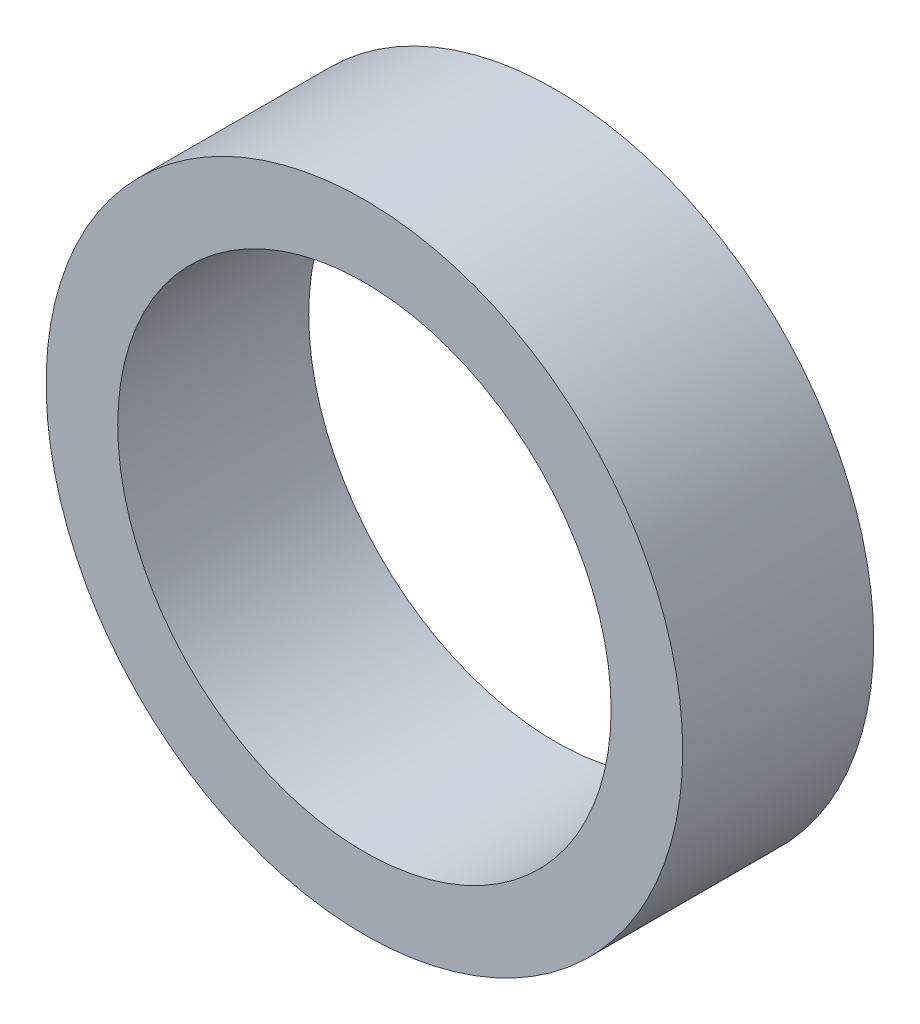
ISO-10303-21;
HEADER;
FILE_DESCRIPTION(('STEP AP214'),'2;1');
FILE_NAME('part.step','',(''),(''),'','','');
FILE_SCHEMA(('AUTOMOTIVE_DESIGN { 1 0 10303 214 1 1 1 1 }'));
ENDSEC;
DATA;
#1=APPLICATION_CONTEXT('core data for automotive mechanical design processes');
#2=APPLICATION_PROTOCOL_DEFINITION('international standard','automotive_design',2000,#1);
#3=PRODUCT_CONTEXT('',#1,'mechanical');
#4=PRODUCT('Part','Part','',(#3));
#5=PRODUCT_RELATED_PRODUCT_CATEGORY('part','',(#4));
#6=PRODUCT_DEFINITION_FORMATION('','',#4);
#7=PRODUCT_DEFINITION_CONTEXT('part definition',#1,'design');
#8=PRODUCT_DEFINITION('design','',#6,#7);
#9=PRODUCT_DEFINITION_SHAPE('','',#8);
#10=(LENGTH_UNIT() NAMED_UNIT(*) SI_UNIT(.MILLI.,.METRE.));
#11=(NAMED_UNIT(*) PLANE_ANGLE_UNIT() SI_UNIT($,.RADIAN.));
#12=(NAMED_UNIT(*) SI_UNIT($,.STERADIAN.) SOLID_ANGLE_UNIT());
#13=UNCERTAINTY_MEASURE_WITH_UNIT(LENGTH_MEASURE(1.E-05),#10,'distance_accuracy_value','');
#14=(GEOMETRIC_REPRESENTATION_CONTEXT(3) GLOBAL_UNCERTAINTY_ASSIGNED_CONTEXT((#13)) GLOBAL_UNIT_ASSIGNED_CONTEXT((#10,
#11,#12)) REPRESENTATION_CONTEXT('',''));
#15=CARTESIAN_POINT('',(0.,0.,0.));
#16=DIRECTION('',(0.,0.,1.));
#17=DIRECTION('',(1.,0.,0.));
#18=AXIS2_PLACEMENT_3D('',#15,#16,#17);
#19=CARTESIAN_POINT('',(0.,0.,6.));
#20=DIRECTION('',(0.,0.,1.));
#21=DIRECTION('',(1.,0.,0.));
#22=AXIS2_PLACEMENT_3D('',#19,#20,#21);
#23=PLANE('',#22);
#24=CARTESIAN_POINT('',(0.,0.,6.));
#25=DIRECTION('',(0.,0.,1.));
#26=DIRECTION('',(1.,0.,0.));
#27=AXIS2_PLACEMENT_3D('',#24,#25,#26);
#28=CIRCLE('',#27,10.);
#29=CARTESIAN_POINT('',(10.,0.,6.));
#30=VERTEX_POINT('',#29);
#31=EDGE_CURVE('E10',#30,#30,#28,.T.);
#32=ORIENTED_EDGE('',*,*,#31,.T.);
#33=EDGE_LOOP('',(#32));
#34=FACE_BOUND('',#33,.T.);
#35=CARTESIAN_POINT('',(0.,0.,6.));
#36=DIRECTION('',(0.,0.,1.));
#37=DIRECTION('',(1.,0.,0.));
#38=AXIS2_PLACEMENT_3D('',#35,#36,#37);
#39=CIRCLE('',#38,7.75);
#40=CARTESIAN_POINT('',(7.75,0.,6.));
#41=VERTEX_POINT('',#40);
#42=EDGE_CURVE('E43',#41,#41,#39,.T.);
#43=ORIENTED_EDGE('',*,*,#42,.F.);
#44=EDGE_LOOP('',(#43));
#45=FACE_BOUND('',#44,.T.);
#46=ADVANCED_FACE('F32',(#34,#45),#23,.T.);
#47=CARTESIAN_POINT('',(0.,0.,0.));
#48=DIRECTION('',(0.,0.,1.));
#49=DIRECTION('',(1.,0.,0.));
#50=AXIS2_PLACEMENT_3D('',#47,#48,#49);
#51=PLANE('',#50);
#52=CARTESIAN_POINT('',(0.,0.,0.));
#53=DIRECTION('',(0.,0.,1.));
#54=DIRECTION('',(1.,0.,0.));
#55=AXIS2_PLACEMENT_3D('',#52,#53,#54);
#56=CIRCLE('',#55,10.);
#57=CARTESIAN_POINT('',(10.,0.,0.));
#58=VERTEX_POINT('',#57);
#59=EDGE_CURVE('E36',#58,#58,#56,.T.);
#60=ORIENTED_EDGE('',*,*,#59,.F.);
#61=EDGE_LOOP('',(#60));
#62=FACE_BOUND('',#61,.T.);
#63=CARTESIAN_POINT('',(0.,0.,0.));
#64=DIRECTION('',(0.,0.,1.));
#65=DIRECTION('',(1.,0.,0.));
#66=AXIS2_PLACEMENT_3D('',#63,#64,#65);
#67=CIRCLE('',#66,7.75);
#68=CARTESIAN_POINT('',(7.75,0.,0.));
#69=VERTEX_POINT('',#68);
#70=EDGE_CURVE('E45',#69,#69,#67,.T.);
#71=ORIENTED_EDGE('',*,*,#70,.T.);
#72=EDGE_LOOP('',(#71));
#73=FACE_BOUND('',#72,.T.);
#74=ADVANCED_FACE('F55',(#62,#73),#51,.F.);
#75=CARTESIAN_POINT('',(0.,0.,6.));
#76=DIRECTION('',(0.,0.,-1.));
#77=DIRECTION('',(-1.,0.,0.));
#78=AXIS2_PLACEMENT_3D('',#75,#76,#77);
#79=CYLINDRICAL_SURFACE('',#78,10.);
#80=ORIENTED_EDGE('',*,*,#31,.F.);
#81=EDGE_LOOP('',(#80));
#82=FACE_BOUND('',#81,.T.);
#83=ORIENTED_EDGE('',*,*,#59,.T.);
#84=EDGE_LOOP('',(#83));
#85=FACE_BOUND('',#84,.T.);
#86=ADVANCED_FACE('F34',(#82,#85),#79,.T.);
#87=CARTESIAN_POINT('',(0.,0.,6.));
#88=DIRECTION('',(0.,0.,-1.));
#89=DIRECTION('',(-1.,0.,0.));
#90=AXIS2_PLACEMENT_3D('',#87,#88,#89);
#91=CYLINDRICAL_SURFACE('',#90,7.75);
#92=ORIENTED_EDGE('',*,*,#42,.T.);
#93=EDGE_LOOP('',(#92));
#94=FACE_BOUND('',#93,.T.);
#95=ORIENTED_EDGE('',*,*,#70,.F.);
#96=EDGE_LOOP('',(#95));
#97=FACE_BOUND('',#96,.T.);
#98=ADVANCED_FACE('F51',(#94,#97),#91,.F.);
#99=CLOSED_SHELL('',(#46,#74,#86,#98));
#100=MANIFOLD_SOLID_BREP('B2',#99);
#101=ADVANCED_BREP_SHAPE_REPRESENTATION('',(#18,#100),#14);
#102=SHAPE_DEFINITION_REPRESENTATION(#9,#101);
ENDSEC;
END-ISO-10303-21;
